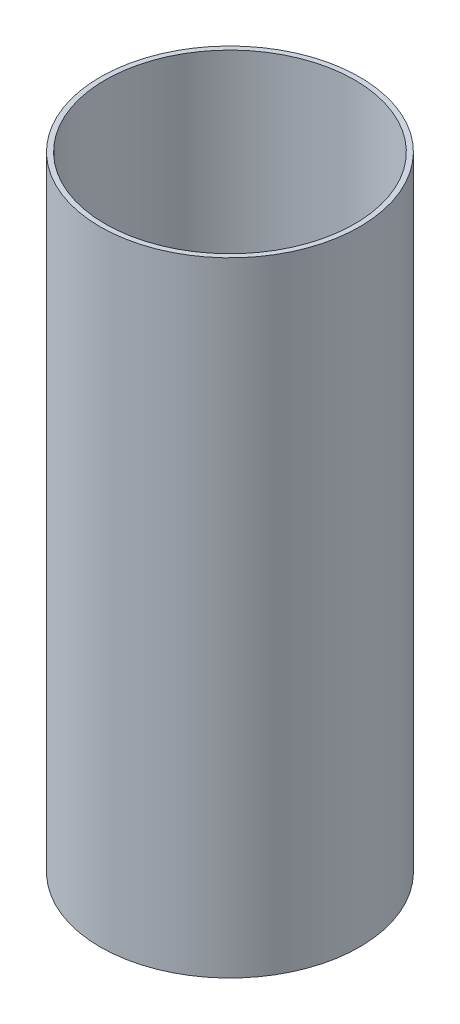
ISO-10303-21;
HEADER;
FILE_DESCRIPTION(('STEP AP214'),'2;1');
FILE_NAME('part.step','',(''),(''),'','','');
FILE_SCHEMA(('AUTOMOTIVE_DESIGN { 1 0 10303 214 1 1 1 1 }'));
ENDSEC;
DATA;
#1=APPLICATION_CONTEXT('core data for automotive mechanical design processes');
#2=APPLICATION_PROTOCOL_DEFINITION('international standard','automotive_design',2000,#1);
#3=PRODUCT_CONTEXT('',#1,'mechanical');
#4=PRODUCT('Part','Part','',(#3));
#5=PRODUCT_RELATED_PRODUCT_CATEGORY('part','',(#4));
#6=PRODUCT_DEFINITION_FORMATION('','',#4);
#7=PRODUCT_DEFINITION_CONTEXT('part definition',#1,'design');
#8=PRODUCT_DEFINITION('design','',#6,#7);
#9=PRODUCT_DEFINITION_SHAPE('','',#8);
#10=(LENGTH_UNIT() NAMED_UNIT(*) SI_UNIT(.MILLI.,.METRE.));
#11=(NAMED_UNIT(*) PLANE_ANGLE_UNIT() SI_UNIT($,.RADIAN.));
#12=(NAMED_UNIT(*) SI_UNIT($,.STERADIAN.) SOLID_ANGLE_UNIT());
#13=UNCERTAINTY_MEASURE_WITH_UNIT(LENGTH_MEASURE(1.E-05),#10,'distance_accuracy_value','');
#14=(GEOMETRIC_REPRESENTATION_CONTEXT(3) GLOBAL_UNCERTAINTY_ASSIGNED_CONTEXT((#13)) GLOBAL_UNIT_ASSIGNED_CONTEXT((#10,
#11,#12)) REPRESENTATION_CONTEXT('',''));
#15=CARTESIAN_POINT('',(0.,0.,0.));
#16=DIRECTION('',(0.,0.,1.));
#17=DIRECTION('',(1.,0.,0.));
#18=AXIS2_PLACEMENT_3D('',#15,#16,#17);
#19=CARTESIAN_POINT('',(0.,190.5,0.));
#20=DIRECTION('',(0.,1.,0.));
#21=DIRECTION('',(0.,0.,1.));
#22=AXIS2_PLACEMENT_3D('',#19,#20,#21);
#23=PLANE('',#22);
#24=CARTESIAN_POINT('',(0.,190.5,0.));
#25=DIRECTION('',(0.,1.,0.));
#26=DIRECTION('',(0.,0.,1.));
#27=AXIS2_PLACEMENT_3D('',#24,#25,#26);
#28=CIRCLE('',#27,39.624);
#29=CARTESIAN_POINT('',(0.,190.5,39.624));
#30=VERTEX_POINT('',#29);
#31=EDGE_CURVE('E10',#30,#30,#28,.T.);
#32=ORIENTED_EDGE('',*,*,#31,.T.);
#33=EDGE_LOOP('',(#32));
#34=FACE_BOUND('',#33,.T.);
#35=CARTESIAN_POINT('',(0.,190.5,0.));
#36=DIRECTION('',(0.,1.,0.));
#37=DIRECTION('',(0.,0.,1.));
#38=AXIS2_PLACEMENT_3D('',#35,#36,#37);
#39=CIRCLE('',#38,38.1);
#40=CARTESIAN_POINT('',(0.,190.5,38.1));
#41=VERTEX_POINT('',#40);
#42=EDGE_CURVE('E56',#41,#41,#39,.T.);
#43=ORIENTED_EDGE('',*,*,#42,.F.);
#44=EDGE_LOOP('',(#43));
#45=FACE_BOUND('',#44,.T.);
#46=ADVANCED_FACE('F43',(#34,#45),#23,.T.);
#47=CARTESIAN_POINT('',(0.,0.,0.));
#48=DIRECTION('',(0.,1.,0.));
#49=DIRECTION('',(0.,0.,1.));
#50=AXIS2_PLACEMENT_3D('',#47,#48,#49);
#51=PLANE('',#50);
#52=CARTESIAN_POINT('',(0.,0.,0.));
#53=DIRECTION('',(0.,1.,0.));
#54=DIRECTION('',(0.,0.,1.));
#55=AXIS2_PLACEMENT_3D('',#52,#53,#54);
#56=CIRCLE('',#55,39.624);
#57=CARTESIAN_POINT('',(0.,0.,39.624));
#58=VERTEX_POINT('',#57);
#59=EDGE_CURVE('E47',#58,#58,#56,.T.);
#60=ORIENTED_EDGE('',*,*,#59,.F.);
#61=EDGE_LOOP('',(#60));
#62=FACE_BOUND('',#61,.T.);
#63=CARTESIAN_POINT('',(0.,0.,0.));
#64=DIRECTION('',(0.,1.,0.));
#65=DIRECTION('',(0.,0.,1.));
#66=AXIS2_PLACEMENT_3D('',#63,#64,#65);
#67=CIRCLE('',#66,38.1);
#68=CARTESIAN_POINT('',(0.,0.,38.1));
#69=VERTEX_POINT('',#68);
#70=EDGE_CURVE('E58',#69,#69,#67,.T.);
#71=ORIENTED_EDGE('',*,*,#70,.T.);
#72=EDGE_LOOP('',(#71));
#73=FACE_BOUND('',#72,.T.);
#74=ADVANCED_FACE('F70',(#62,#73),#51,.F.);
#75=CARTESIAN_POINT('',(0.,190.5,0.));
#76=DIRECTION('',(0.,-1.,0.));
#77=DIRECTION('',(0.,0.,-1.));
#78=AXIS2_PLACEMENT_3D('',#75,#76,#77);
#79=CYLINDRICAL_SURFACE('',#78,39.624);
#80=ORIENTED_EDGE('',*,*,#31,.F.);
#81=EDGE_LOOP('',(#80));
#82=FACE_BOUND('',#81,.T.);
#83=ORIENTED_EDGE('',*,*,#59,.T.);
#84=EDGE_LOOP('',(#83));
#85=FACE_BOUND('',#84,.T.);
#86=ADVANCED_FACE('F45',(#82,#85),#79,.T.);
#87=CARTESIAN_POINT('',(0.,190.5,0.));
#88=DIRECTION('',(0.,-1.,0.));
#89=DIRECTION('',(0.,0.,-1.));
#90=AXIS2_PLACEMENT_3D('',#87,#88,#89);
#91=CYLINDRICAL_SURFACE('',#90,38.1);
#92=ORIENTED_EDGE('',*,*,#42,.T.);
#93=EDGE_LOOP('',(#92));
#94=FACE_BOUND('',#93,.T.);
#95=ORIENTED_EDGE('',*,*,#70,.F.);
#96=EDGE_LOOP('',(#95));
#97=FACE_BOUND('',#96,.T.);
#98=ADVANCED_FACE('F66',(#94,#97),#91,.F.);
#99=CLOSED_SHELL('',(#46,#74,#86,#98));
#100=MANIFOLD_SOLID_BREP('B2',#99);
#101=ADVANCED_BREP_SHAPE_REPRESENTATION('',(#18,#100),#14);
#102=SHAPE_DEFINITION_REPRESENTATION(#9,#101);
ENDSEC;
END-ISO-10303-21;
